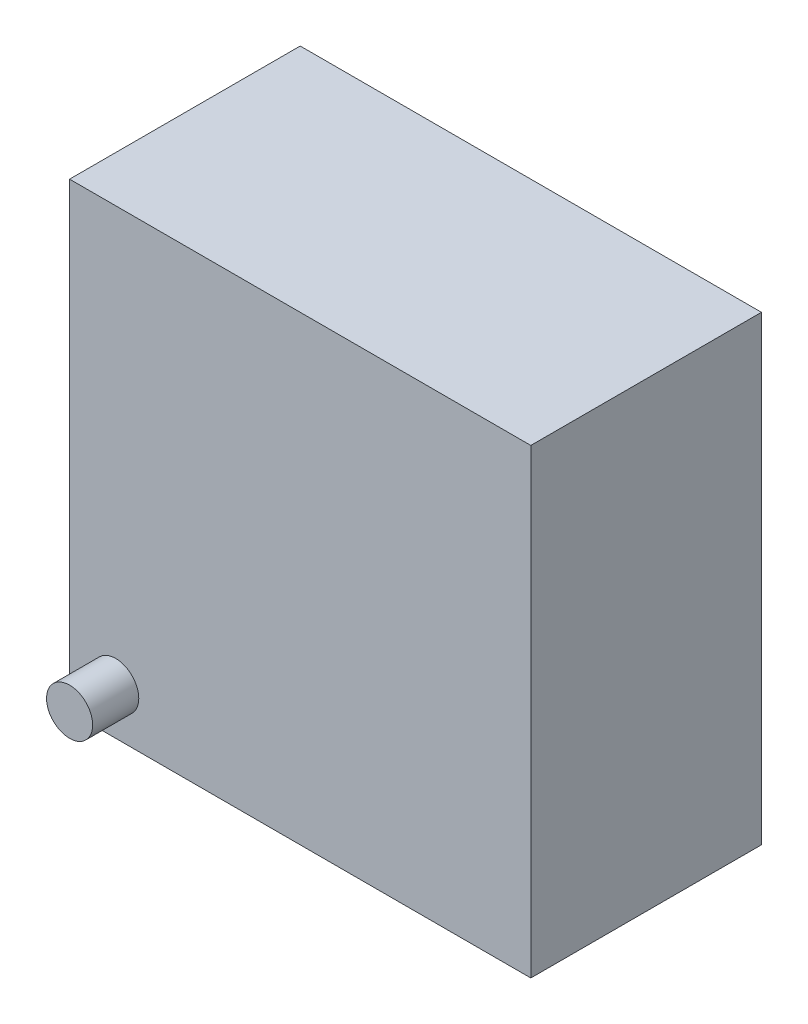
ISO-10303-21;
HEADER;
FILE_DESCRIPTION(('STEP AP214'),'2;1');
FILE_NAME('part.step','',(''),(''),'','','');
FILE_SCHEMA(('AUTOMOTIVE_DESIGN { 1 0 10303 214 1 1 1 1 }'));
ENDSEC;
DATA;
#1=APPLICATION_CONTEXT('core data for automotive mechanical design processes');
#2=APPLICATION_PROTOCOL_DEFINITION('international standard','automotive_design',2000,#1);
#3=PRODUCT_CONTEXT('',#1,'mechanical');
#4=PRODUCT('Part','Part','',(#3));
#5=PRODUCT_RELATED_PRODUCT_CATEGORY('part','',(#4));
#6=PRODUCT_DEFINITION_FORMATION('','',#4);
#7=PRODUCT_DEFINITION_CONTEXT('part definition',#1,'design');
#8=PRODUCT_DEFINITION('design','',#6,#7);
#9=PRODUCT_DEFINITION_SHAPE('','',#8);
#10=(LENGTH_UNIT() NAMED_UNIT(*) SI_UNIT(.MILLI.,.METRE.));
#11=(NAMED_UNIT(*) PLANE_ANGLE_UNIT() SI_UNIT($,.RADIAN.));
#12=(NAMED_UNIT(*) SI_UNIT($,.STERADIAN.) SOLID_ANGLE_UNIT());
#13=UNCERTAINTY_MEASURE_WITH_UNIT(LENGTH_MEASURE(1.E-05),#10,'distance_accuracy_value','');
#14=(GEOMETRIC_REPRESENTATION_CONTEXT(3) GLOBAL_UNCERTAINTY_ASSIGNED_CONTEXT((#13)) GLOBAL_UNIT_ASSIGNED_CONTEXT((#10,
#11,#12)) REPRESENTATION_CONTEXT('',''));
#15=CARTESIAN_POINT('',(0.,0.,0.));
#16=DIRECTION('',(0.,0.,1.));
#17=DIRECTION('',(1.,0.,0.));
#18=AXIS2_PLACEMENT_3D('',#15,#16,#17);
#19=CARTESIAN_POINT('',(0.,0.,10.));
#20=DIRECTION('',(1.,0.,0.));
#21=DIRECTION('',(0.,0.,-1.));
#22=AXIS2_PLACEMENT_3D('',#19,#20,#21);
#23=PLANE('',#22);
#24=DIRECTION('',(0.,-1.,0.));
#25=VECTOR('',#24,1.);
#26=CARTESIAN_POINT('',(0.,0.,0.));
#27=LINE('',#26,#25);
#28=CARTESIAN_POINT('',(0.,20.,0.));
#29=VERTEX_POINT('',#28);
#30=CARTESIAN_POINT('',(0.,0.,0.));
#31=VERTEX_POINT('',#30);
#32=EDGE_CURVE('E106',#29,#31,#27,.T.);
#33=ORIENTED_EDGE('',*,*,#32,.T.);
#34=DIRECTION('',(0.,0.,-1.));
#35=VECTOR('',#34,1.);
#36=CARTESIAN_POINT('',(0.,0.,10.));
#37=LINE('',#36,#35);
#38=CARTESIAN_POINT('',(0.,0.,10.));
#39=VERTEX_POINT('',#38);
#40=EDGE_CURVE('E43',#39,#31,#37,.T.);
#41=ORIENTED_EDGE('',*,*,#40,.F.);
#42=DIRECTION('',(0.,-1.,0.));
#43=VECTOR('',#42,1.);
#44=CARTESIAN_POINT('',(0.,0.,10.));
#45=LINE('',#44,#43);
#46=CARTESIAN_POINT('',(0.,20.,10.));
#47=VERTEX_POINT('',#46);
#48=EDGE_CURVE('E91',#47,#39,#45,.T.);
#49=ORIENTED_EDGE('',*,*,#48,.F.);
#50=DIRECTION('',(0.,0.,-1.));
#51=VECTOR('',#50,1.);
#52=CARTESIAN_POINT('',(0.,20.,10.));
#53=LINE('',#52,#51);
#54=EDGE_CURVE('E105',#47,#29,#53,.T.);
#55=ORIENTED_EDGE('',*,*,#54,.T.);
#56=EDGE_LOOP('',(#33,#41,#49,#55));
#57=FACE_BOUND('',#56,.T.);
#58=ADVANCED_FACE('F37',(#57),#23,.F.);
#59=CARTESIAN_POINT('',(0.,0.,10.));
#60=DIRECTION('',(0.,1.,0.));
#61=DIRECTION('',(0.,0.,1.));
#62=AXIS2_PLACEMENT_3D('',#59,#60,#61);
#63=PLANE('',#62);
#64=DIRECTION('',(1.,0.,0.));
#65=VECTOR('',#64,1.);
#66=CARTESIAN_POINT('',(0.,0.,0.));
#67=LINE('',#66,#65);
#68=CARTESIAN_POINT('',(20.,0.,0.));
#69=VERTEX_POINT('',#68);
#70=EDGE_CURVE('E98',#31,#69,#67,.T.);
#71=ORIENTED_EDGE('',*,*,#70,.T.);
#72=DIRECTION('',(0.,0.,-1.));
#73=VECTOR('',#72,1.);
#74=CARTESIAN_POINT('',(20.,0.,10.));
#75=LINE('',#74,#73);
#76=CARTESIAN_POINT('',(20.,0.,10.));
#77=VERTEX_POINT('',#76);
#78=EDGE_CURVE('E96',#77,#69,#75,.T.);
#79=ORIENTED_EDGE('',*,*,#78,.F.);
#80=DIRECTION('',(1.,0.,0.));
#81=VECTOR('',#80,1.);
#82=CARTESIAN_POINT('',(0.,0.,10.));
#83=LINE('',#82,#81);
#84=EDGE_CURVE('E86',#39,#77,#83,.T.);
#85=ORIENTED_EDGE('',*,*,#84,.F.);
#86=ORIENTED_EDGE('',*,*,#40,.T.);
#87=EDGE_LOOP('',(#71,#79,#85,#86));
#88=FACE_BOUND('',#87,.T.);
#89=ADVANCED_FACE('F100',(#88),#63,.F.);
#90=CARTESIAN_POINT('',(20.,0.,10.));
#91=DIRECTION('',(-1.,0.,0.));
#92=DIRECTION('',(0.,0.,1.));
#93=AXIS2_PLACEMENT_3D('',#90,#91,#92);
#94=PLANE('',#93);
#95=DIRECTION('',(0.,1.,0.));
#96=VECTOR('',#95,1.);
#97=CARTESIAN_POINT('',(20.,0.,0.));
#98=LINE('',#97,#96);
#99=CARTESIAN_POINT('',(20.,20.,0.));
#100=VERTEX_POINT('',#99);
#101=EDGE_CURVE('E74',#69,#100,#98,.T.);
#102=ORIENTED_EDGE('',*,*,#101,.T.);
#103=DIRECTION('',(0.,0.,-1.));
#104=VECTOR('',#103,1.);
#105=CARTESIAN_POINT('',(20.,20.,10.));
#106=LINE('',#105,#104);
#107=CARTESIAN_POINT('',(20.,20.,10.));
#108=VERTEX_POINT('',#107);
#109=EDGE_CURVE('E97',#108,#100,#106,.T.);
#110=ORIENTED_EDGE('',*,*,#109,.F.);
#111=DIRECTION('',(0.,1.,0.));
#112=VECTOR('',#111,1.);
#113=CARTESIAN_POINT('',(20.,0.,10.));
#114=LINE('',#113,#112);
#115=EDGE_CURVE('E93',#77,#108,#114,.T.);
#116=ORIENTED_EDGE('',*,*,#115,.F.);
#117=ORIENTED_EDGE('',*,*,#78,.T.);
#118=EDGE_LOOP('',(#102,#110,#116,#117));
#119=FACE_BOUND('',#118,.T.);
#120=ADVANCED_FACE('F99',(#119),#94,.F.);
#121=CARTESIAN_POINT('',(0.,20.,10.));
#122=DIRECTION('',(0.,-1.,0.));
#123=DIRECTION('',(0.,0.,-1.));
#124=AXIS2_PLACEMENT_3D('',#121,#122,#123);
#125=PLANE('',#124);
#126=DIRECTION('',(-1.,0.,0.));
#127=VECTOR('',#126,1.);
#128=CARTESIAN_POINT('',(0.,20.,0.));
#129=LINE('',#128,#127);
#130=EDGE_CURVE('E76',#100,#29,#129,.T.);
#131=ORIENTED_EDGE('',*,*,#130,.T.);
#132=ORIENTED_EDGE('',*,*,#54,.F.);
#133=DIRECTION('',(-1.,0.,0.));
#134=VECTOR('',#133,1.);
#135=CARTESIAN_POINT('',(0.,20.,10.));
#136=LINE('',#135,#134);
#137=EDGE_CURVE('E60',#108,#47,#136,.T.);
#138=ORIENTED_EDGE('',*,*,#137,.F.);
#139=ORIENTED_EDGE('',*,*,#109,.T.);
#140=EDGE_LOOP('',(#131,#132,#138,#139));
#141=FACE_BOUND('',#140,.T.);
#142=ADVANCED_FACE('F111',(#141),#125,.F.);
#143=CARTESIAN_POINT('',(0.,0.,10.));
#144=DIRECTION('',(0.,0.,-1.));
#145=DIRECTION('',(-1.,0.,0.));
#146=AXIS2_PLACEMENT_3D('',#143,#144,#145);
#147=PLANE('',#146);
#148=CARTESIAN_POINT('',(2.,2.,10.));
#149=DIRECTION('',(0.,0.,1.));
#150=DIRECTION('',(1.,0.,0.));
#151=AXIS2_PLACEMENT_3D('',#148,#149,#150);
#152=CIRCLE('',#151,1.);
#153=CARTESIAN_POINT('',(3.,2.,10.));
#154=VERTEX_POINT('',#153);
#155=EDGE_CURVE('E11',#154,#154,#152,.T.);
#156=ORIENTED_EDGE('',*,*,#155,.F.);
#157=EDGE_LOOP('',(#156));
#158=FACE_BOUND('',#157,.T.);
#159=ORIENTED_EDGE('',*,*,#48,.T.);
#160=ORIENTED_EDGE('',*,*,#84,.T.);
#161=ORIENTED_EDGE('',*,*,#115,.T.);
#162=ORIENTED_EDGE('',*,*,#137,.T.);
#163=EDGE_LOOP('',(#159,#160,#161,#162));
#164=FACE_BOUND('',#163,.T.);
#165=ADVANCED_FACE('F90',(#158,#164),#147,.F.);
#166=CARTESIAN_POINT('',(0.,0.,0.));
#167=DIRECTION('',(0.,0.,-1.));
#168=DIRECTION('',(-1.,0.,0.));
#169=AXIS2_PLACEMENT_3D('',#166,#167,#168);
#170=PLANE('',#169);
#171=ORIENTED_EDGE('',*,*,#32,.F.);
#172=ORIENTED_EDGE('',*,*,#130,.F.);
#173=ORIENTED_EDGE('',*,*,#101,.F.);
#174=ORIENTED_EDGE('',*,*,#70,.F.);
#175=EDGE_LOOP('',(#171,#172,#173,#174));
#176=FACE_BOUND('',#175,.T.);
#177=ADVANCED_FACE('F117',(#176),#170,.T.);
#178=CARTESIAN_POINT('',(2.,2.,12.));
#179=DIRECTION('',(0.,0.,-1.));
#180=DIRECTION('',(-1.,0.,0.));
#181=AXIS2_PLACEMENT_3D('',#178,#179,#180);
#182=CYLINDRICAL_SURFACE('',#181,1.);
#183=CARTESIAN_POINT('',(2.,2.,12.));
#184=DIRECTION('',(0.,0.,1.));
#185=DIRECTION('',(1.,0.,0.));
#186=AXIS2_PLACEMENT_3D('',#183,#184,#185);
#187=CIRCLE('',#186,1.);
#188=CARTESIAN_POINT('',(3.,2.,12.));
#189=VERTEX_POINT('',#188);
#190=EDGE_CURVE('E108',#189,#189,#187,.T.);
#191=ORIENTED_EDGE('',*,*,#190,.F.);
#192=EDGE_LOOP('',(#191));
#193=FACE_BOUND('',#192,.T.);
#194=ORIENTED_EDGE('',*,*,#155,.T.);
#195=EDGE_LOOP('',(#194));
#196=FACE_BOUND('',#195,.T.);
#197=ADVANCED_FACE('F122',(#193,#196),#182,.T.);
#198=CARTESIAN_POINT('',(2.,2.,12.));
#199=DIRECTION('',(0.,0.,1.));
#200=DIRECTION('',(1.,0.,0.));
#201=AXIS2_PLACEMENT_3D('',#198,#199,#200);
#202=PLANE('',#201);
#203=ORIENTED_EDGE('',*,*,#190,.T.);
#204=EDGE_LOOP('',(#203));
#205=FACE_BOUND('',#204,.T.);
#206=ADVANCED_FACE('F125',(#205),#202,.T.);
#207=CLOSED_SHELL('',(#58,#89,#120,#142,#165,#177,#197,#206));
#208=MANIFOLD_SOLID_BREP('B2',#207);
#209=ADVANCED_BREP_SHAPE_REPRESENTATION('',(#18,#208),#14);
#210=SHAPE_DEFINITION_REPRESENTATION(#9,#209);
ENDSEC;
END-ISO-10303-21;
